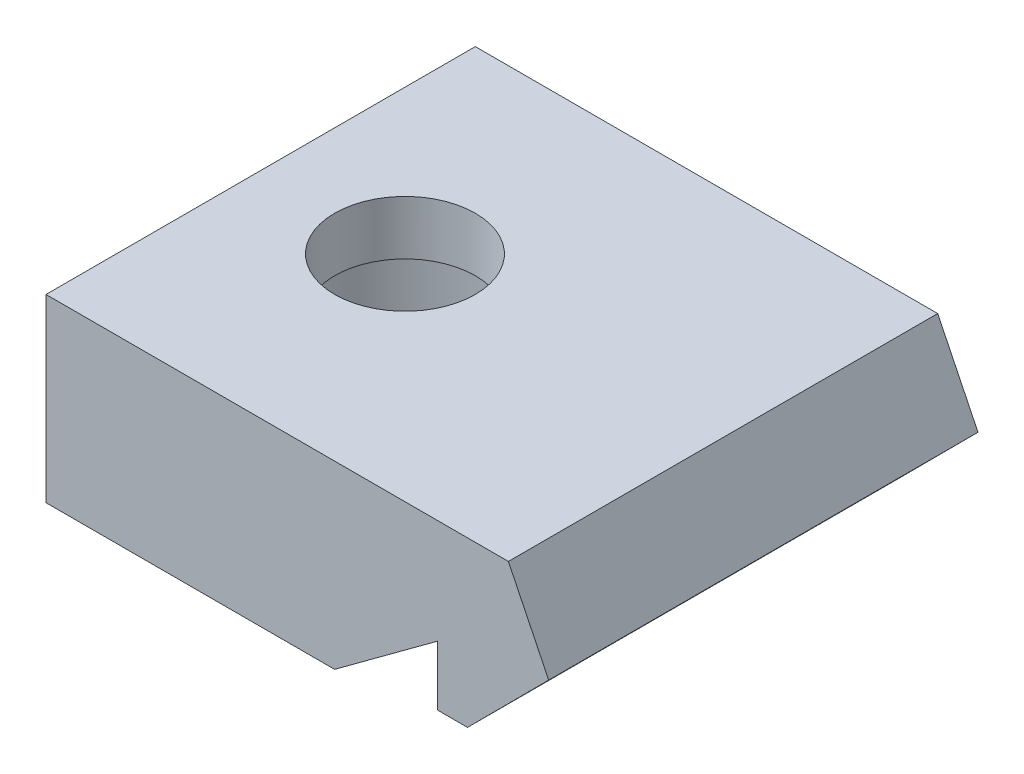
ISO-10303-21;
HEADER;
FILE_DESCRIPTION(('STEP AP214'),'2;1');
FILE_NAME('part.step','',(''),(''),'','','');
FILE_SCHEMA(('AUTOMOTIVE_DESIGN { 1 0 10303 214 1 1 1 1 }'));
ENDSEC;
DATA;
#1=APPLICATION_CONTEXT('core data for automotive mechanical design processes');
#2=APPLICATION_PROTOCOL_DEFINITION('international standard','automotive_design',2000,#1);
#3=PRODUCT_CONTEXT('',#1,'mechanical');
#4=PRODUCT('Part','Part','',(#3));
#5=PRODUCT_RELATED_PRODUCT_CATEGORY('part','',(#4));
#6=PRODUCT_DEFINITION_FORMATION('','',#4);
#7=PRODUCT_DEFINITION_CONTEXT('part definition',#1,'design');
#8=PRODUCT_DEFINITION('design','',#6,#7);
#9=PRODUCT_DEFINITION_SHAPE('','',#8);
#10=(LENGTH_UNIT() NAMED_UNIT(*) SI_UNIT(.MILLI.,.METRE.));
#11=(NAMED_UNIT(*) PLANE_ANGLE_UNIT() SI_UNIT($,.RADIAN.));
#12=(NAMED_UNIT(*) SI_UNIT($,.STERADIAN.) SOLID_ANGLE_UNIT());
#13=UNCERTAINTY_MEASURE_WITH_UNIT(LENGTH_MEASURE(1.E-05),#10,'distance_accuracy_value','');
#14=(GEOMETRIC_REPRESENTATION_CONTEXT(3) GLOBAL_UNCERTAINTY_ASSIGNED_CONTEXT((#13)) GLOBAL_UNIT_ASSIGNED_CONTEXT((#10,
#11,#12)) REPRESENTATION_CONTEXT('',''));
#15=CARTESIAN_POINT('',(0.,0.,0.));
#16=DIRECTION('',(0.,0.,1.));
#17=DIRECTION('',(1.,0.,0.));
#18=AXIS2_PLACEMENT_3D('',#15,#16,#17);
#19=CARTESIAN_POINT('',(4.,0.00100000000000013,0.));
#20=DIRECTION('',(0.,-1.,0.));
#21=DIRECTION('',(0.,0.,-1.));
#22=AXIS2_PLACEMENT_3D('',#19,#20,#21);
#23=CYLINDRICAL_SURFACE('',#22,1.95);
#24=CARTESIAN_POINT('',(4.,0.,0.));
#25=DIRECTION('',(0.,1.,0.));
#26=DIRECTION('',(0.,0.,1.));
#27=AXIS2_PLACEMENT_3D('',#24,#25,#26);
#28=CIRCLE('',#27,1.95);
#29=CARTESIAN_POINT('',(4.,0.,1.95));
#30=VERTEX_POINT('',#29);
#31=EDGE_CURVE('E136',#30,#30,#28,.F.);
#32=ORIENTED_EDGE('',*,*,#31,.F.);
#33=EDGE_LOOP('',(#32));
#34=FACE_BOUND('',#33,.T.);
#35=CARTESIAN_POINT('',(4.,-1.5,0.));
#36=DIRECTION('',(0.,-1.,0.));
#37=DIRECTION('',(0.,0.,-1.));
#38=AXIS2_PLACEMENT_3D('',#35,#36,#37);
#39=CIRCLE('',#38,1.95);
#40=CARTESIAN_POINT('',(4.,-1.5,-1.95));
#41=VERTEX_POINT('',#40);
#42=EDGE_CURVE('E39',#41,#41,#39,.F.);
#43=ORIENTED_EDGE('',*,*,#42,.F.);
#44=EDGE_LOOP('',(#43));
#45=FACE_BOUND('',#44,.T.);
#46=ADVANCED_FACE('F35',(#34,#45),#23,.F.);
#47=CARTESIAN_POINT('',(0.,-5.,5.95));
#48=DIRECTION('',(0.,1.,0.));
#49=DIRECTION('',(0.,0.,1.));
#50=AXIS2_PLACEMENT_3D('',#47,#48,#49);
#51=PLANE('',#50);
#52=CARTESIAN_POINT('',(4.,-5.,0.));
#53=DIRECTION('',(0.,-1.,0.));
#54=DIRECTION('',(0.,0.,-1.));
#55=AXIS2_PLACEMENT_3D('',#52,#53,#54);
#56=CIRCLE('',#55,3.5);
#57=CARTESIAN_POINT('',(4.,-5.,-3.5));
#58=VERTEX_POINT('',#57);
#59=EDGE_CURVE('E184',#58,#58,#56,.T.);
#60=ORIENTED_EDGE('',*,*,#59,.F.);
#61=EDGE_LOOP('',(#60));
#62=FACE_BOUND('',#61,.T.);
#63=DIRECTION('',(1.,0.,0.));
#64=VECTOR('',#63,1.);
#65=CARTESIAN_POINT('',(0.,-5.,-5.95));
#66=LINE('',#65,#64);
#67=CARTESIAN_POINT('',(0.,-5.,-5.95));
#68=VERTEX_POINT('',#67);
#69=CARTESIAN_POINT('',(8.,-5.,-5.95));
#70=VERTEX_POINT('',#69);
#71=EDGE_CURVE('E132',#68,#70,#66,.T.);
#72=ORIENTED_EDGE('',*,*,#71,.T.);
#73=DIRECTION('',(0.,0.,-1.));
#74=VECTOR('',#73,1.);
#75=CARTESIAN_POINT('',(8.,-5.,5.95));
#76=LINE('',#75,#74);
#77=CARTESIAN_POINT('',(8.,-5.,5.95));
#78=VERTEX_POINT('',#77);
#79=EDGE_CURVE('E11',#78,#70,#76,.T.);
#80=ORIENTED_EDGE('',*,*,#79,.F.);
#81=DIRECTION('',(1.,0.,0.));
#82=VECTOR('',#81,1.);
#83=CARTESIAN_POINT('',(0.,-5.,5.95));
#84=LINE('',#83,#82);
#85=CARTESIAN_POINT('',(0.,-5.,5.95));
#86=VERTEX_POINT('',#85);
#87=EDGE_CURVE('E148',#86,#78,#84,.T.);
#88=ORIENTED_EDGE('',*,*,#87,.F.);
#89=DIRECTION('',(0.,0.,-1.));
#90=VECTOR('',#89,1.);
#91=CARTESIAN_POINT('',(0.,-5.,5.95));
#92=LINE('',#91,#90);
#93=EDGE_CURVE('E128',#86,#68,#92,.T.);
#94=ORIENTED_EDGE('',*,*,#93,.T.);
#95=EDGE_LOOP('',(#72,#80,#88,#94));
#96=FACE_BOUND('',#95,.T.);
#97=ADVANCED_FACE('F37',(#62,#96),#51,.F.);
#98=CARTESIAN_POINT('',(5.2059710551942,-7.060223000472,5.95));
#99=DIRECTION('',(-0.593472483948854,0.804854279230457,0.));
#100=DIRECTION('',(-0.804854279230457,-0.593472483948854,0.));
#101=AXIS2_PLACEMENT_3D('',#98,#99,#100);
#102=PLANE('',#101);
#103=DIRECTION('',(0.804854279230457,0.593472483948854,0.));
#104=VECTOR('',#103,1.);
#105=CARTESIAN_POINT('',(5.2059710551942,-7.060223000472,-5.95));
#106=LINE('',#105,#104);
#107=CARTESIAN_POINT('',(10.8492750138885,-2.89904040572093,-5.95));
#108=VERTEX_POINT('',#107);
#109=EDGE_CURVE('E135',#70,#108,#106,.T.);
#110=ORIENTED_EDGE('',*,*,#109,.T.);
#111=DIRECTION('',(0.,0.,-1.));
#112=VECTOR('',#111,1.);
#113=CARTESIAN_POINT('',(10.8492750138885,-2.89904040572093,5.95));
#114=LINE('',#113,#112);
#115=CARTESIAN_POINT('',(10.8492750138885,-2.89904040572093,5.95));
#116=VERTEX_POINT('',#115);
#117=EDGE_CURVE('E45',#116,#108,#114,.T.);
#118=ORIENTED_EDGE('',*,*,#117,.F.);
#119=DIRECTION('',(0.804854279230457,0.593472483948854,0.));
#120=VECTOR('',#119,1.);
#121=CARTESIAN_POINT('',(5.2059710551942,-7.060223000472,5.95));
#122=LINE('',#121,#120);
#123=EDGE_CURVE('E92',#78,#116,#122,.T.);
#124=ORIENTED_EDGE('',*,*,#123,.F.);
#125=ORIENTED_EDGE('',*,*,#79,.T.);
#126=EDGE_LOOP('',(#110,#118,#124,#125));
#127=FACE_BOUND('',#126,.T.);
#128=ADVANCED_FACE('F202',(#127),#102,.F.);
#129=CARTESIAN_POINT('',(10.8492750138885,0.,5.95));
#130=DIRECTION('',(1.,0.,0.));
#131=DIRECTION('',(0.,0.,-1.));
#132=AXIS2_PLACEMENT_3D('',#129,#130,#131);
#133=PLANE('',#132);
#134=DIRECTION('',(0.,-1.,0.));
#135=VECTOR('',#134,1.);
#136=CARTESIAN_POINT('',(10.8492750138885,0.,-5.95));
#137=LINE('',#136,#135);
#138=CARTESIAN_POINT('',(10.8492750138885,-4.55119956607395,-5.95));
#139=VERTEX_POINT('',#138);
#140=EDGE_CURVE('E138',#108,#139,#137,.T.);
#141=ORIENTED_EDGE('',*,*,#140,.T.);
#142=DIRECTION('',(0.,0.,-1.));
#143=VECTOR('',#142,1.);
#144=CARTESIAN_POINT('',(10.8492750138885,-4.55119956607395,5.95));
#145=LINE('',#144,#143);
#146=CARTESIAN_POINT('',(10.8492750138885,-4.55119956607395,5.95));
#147=VERTEX_POINT('',#146);
#148=EDGE_CURVE('E155',#147,#139,#145,.T.);
#149=ORIENTED_EDGE('',*,*,#148,.F.);
#150=DIRECTION('',(0.,-1.,0.));
#151=VECTOR('',#150,1.);
#152=CARTESIAN_POINT('',(10.8492750138885,0.,5.95));
#153=LINE('',#152,#151);
#154=EDGE_CURVE('E164',#116,#147,#153,.T.);
#155=ORIENTED_EDGE('',*,*,#154,.F.);
#156=ORIENTED_EDGE('',*,*,#117,.T.);
#157=EDGE_LOOP('',(#141,#149,#155,#156));
#158=FACE_BOUND('',#157,.T.);
#159=ADVANCED_FACE('F162',(#158),#133,.F.);
#160=CARTESIAN_POINT('',(0.,-4.55119956607395,5.95));
#161=DIRECTION('',(0.,1.,0.));
#162=DIRECTION('',(0.,0.,1.));
#163=AXIS2_PLACEMENT_3D('',#160,#161,#162);
#164=PLANE('',#163);
#165=DIRECTION('',(1.,0.,0.));
#166=VECTOR('',#165,1.);
#167=CARTESIAN_POINT('',(0.,-4.55119956607395,-5.95));
#168=LINE('',#167,#166);
#169=CARTESIAN_POINT('',(11.6837002450459,-4.55119956607395,-5.95));
#170=VERTEX_POINT('',#169);
#171=EDGE_CURVE('E140',#139,#170,#168,.T.);
#172=ORIENTED_EDGE('',*,*,#171,.T.);
#173=DIRECTION('',(0.,0.,-1.));
#174=VECTOR('',#173,1.);
#175=CARTESIAN_POINT('',(11.6837002450459,-4.55119956607395,5.95));
#176=LINE('',#175,#174);
#177=CARTESIAN_POINT('',(11.6837002450459,-4.55119956607395,5.95));
#178=VERTEX_POINT('',#177);
#179=EDGE_CURVE('E152',#178,#170,#176,.T.);
#180=ORIENTED_EDGE('',*,*,#179,.F.);
#181=DIRECTION('',(1.,0.,0.));
#182=VECTOR('',#181,1.);
#183=CARTESIAN_POINT('',(0.,-4.55119956607395,5.95));
#184=LINE('',#183,#182);
#185=EDGE_CURVE('E176',#147,#178,#184,.T.);
#186=ORIENTED_EDGE('',*,*,#185,.F.);
#187=ORIENTED_EDGE('',*,*,#148,.T.);
#188=EDGE_LOOP('',(#172,#180,#186,#187));
#189=FACE_BOUND('',#188,.T.);
#190=ADVANCED_FACE('F172',(#189),#164,.F.);
#191=CARTESIAN_POINT('',(8.14380815321423,-8.10711386186035,5.95));
#192=DIRECTION('',(-0.708701609006506,0.70550834820829,0.));
#193=DIRECTION('',(-0.70550834820829,-0.708701609006506,0.));
#194=AXIS2_PLACEMENT_3D('',#191,#192,#193);
#195=PLANE('',#194);
#196=DIRECTION('',(0.70550834820829,0.708701609006506,0.));
#197=VECTOR('',#196,1.);
#198=CARTESIAN_POINT('',(8.14380815321423,-8.10711386186035,-5.95));
#199=LINE('',#198,#197);
#200=CARTESIAN_POINT('',(13.9337939797183,-2.2909214925011,-5.95));
#201=VERTEX_POINT('',#200);
#202=EDGE_CURVE('E142',#170,#201,#199,.T.);
#203=ORIENTED_EDGE('',*,*,#202,.T.);
#204=DIRECTION('',(0.,0.,-1.));
#205=VECTOR('',#204,1.);
#206=CARTESIAN_POINT('',(13.9337939797183,-2.2909214925011,5.95));
#207=LINE('',#206,#205);
#208=CARTESIAN_POINT('',(13.9337939797183,-2.2909214925011,5.95));
#209=VERTEX_POINT('',#208);
#210=EDGE_CURVE('E124',#209,#201,#207,.T.);
#211=ORIENTED_EDGE('',*,*,#210,.F.);
#212=DIRECTION('',(0.70550834820829,0.708701609006506,0.));
#213=VECTOR('',#212,1.);
#214=CARTESIAN_POINT('',(8.14380815321423,-8.10711386186035,5.95));
#215=LINE('',#214,#213);
#216=EDGE_CURVE('E111',#178,#209,#215,.T.);
#217=ORIENTED_EDGE('',*,*,#216,.F.);
#218=ORIENTED_EDGE('',*,*,#179,.T.);
#219=EDGE_LOOP('',(#203,#211,#217,#218));
#220=FACE_BOUND('',#219,.T.);
#221=ADVANCED_FACE('F175',(#220),#195,.F.);
#222=CARTESIAN_POINT('',(10.3549259412529,5.04897173889507,5.95));
#223=DIRECTION('',(-0.898844079831908,-0.438268547983004,0.));
#224=DIRECTION('',(0.438268547983004,-0.898844079831908,0.));
#225=AXIS2_PLACEMENT_3D('',#222,#223,#224);
#226=PLANE('',#225);
#227=DIRECTION('',(-0.438268547983004,0.898844079831908,0.));
#228=VECTOR('',#227,1.);
#229=CARTESIAN_POINT('',(10.3549259412529,5.04897173889507,-5.95));
#230=LINE('',#229,#228);
#231=CARTESIAN_POINT('',(12.8167606047538,0.,-5.95));
#232=VERTEX_POINT('',#231);
#233=EDGE_CURVE('E120',#201,#232,#230,.T.);
#234=ORIENTED_EDGE('',*,*,#233,.T.);
#235=DIRECTION('',(0.,0.,-1.));
#236=VECTOR('',#235,1.);
#237=CARTESIAN_POINT('',(12.8167606047538,0.,5.95));
#238=LINE('',#237,#236);
#239=CARTESIAN_POINT('',(12.8167606047538,0.,5.95));
#240=VERTEX_POINT('',#239);
#241=EDGE_CURVE('E117',#240,#232,#238,.T.);
#242=ORIENTED_EDGE('',*,*,#241,.F.);
#243=DIRECTION('',(-0.438268547983004,0.898844079831908,0.));
#244=VECTOR('',#243,1.);
#245=CARTESIAN_POINT('',(10.3549259412529,5.04897173889507,5.95));
#246=LINE('',#245,#244);
#247=EDGE_CURVE('E105',#209,#240,#246,.T.);
#248=ORIENTED_EDGE('',*,*,#247,.F.);
#249=ORIENTED_EDGE('',*,*,#210,.T.);
#250=EDGE_LOOP('',(#234,#242,#248,#249));
#251=FACE_BOUND('',#250,.T.);
#252=ADVANCED_FACE('F118',(#251),#226,.F.);
#253=CARTESIAN_POINT('',(0.,0.,5.95));
#254=DIRECTION('',(0.,1.,0.));
#255=DIRECTION('',(0.,0.,1.));
#256=AXIS2_PLACEMENT_3D('',#253,#254,#255);
#257=PLANE('',#256);
#258=ORIENTED_EDGE('',*,*,#31,.T.);
#259=EDGE_LOOP('',(#258));
#260=FACE_BOUND('',#259,.T.);
#261=DIRECTION('',(1.,0.,0.));
#262=VECTOR('',#261,1.);
#263=CARTESIAN_POINT('',(0.,0.,-5.95));
#264=LINE('',#263,#262);
#265=CARTESIAN_POINT('',(0.,0.,-5.95));
#266=VERTEX_POINT('',#265);
#267=EDGE_CURVE('E145',#266,#232,#264,.T.);
#268=ORIENTED_EDGE('',*,*,#267,.F.);
#269=DIRECTION('',(0.,0.,-1.));
#270=VECTOR('',#269,1.);
#271=CARTESIAN_POINT('',(0.,0.,5.95));
#272=LINE('',#271,#270);
#273=CARTESIAN_POINT('',(0.,0.,5.95));
#274=VERTEX_POINT('',#273);
#275=EDGE_CURVE('E81',#274,#266,#272,.T.);
#276=ORIENTED_EDGE('',*,*,#275,.F.);
#277=DIRECTION('',(1.,0.,0.));
#278=VECTOR('',#277,1.);
#279=CARTESIAN_POINT('',(0.,0.,5.95));
#280=LINE('',#279,#278);
#281=EDGE_CURVE('E109',#274,#240,#280,.T.);
#282=ORIENTED_EDGE('',*,*,#281,.T.);
#283=ORIENTED_EDGE('',*,*,#241,.T.);
#284=EDGE_LOOP('',(#268,#276,#282,#283));
#285=FACE_BOUND('',#284,.T.);
#286=ADVANCED_FACE('F126',(#260,#285),#257,.T.);
#287=CARTESIAN_POINT('',(0.,0.,5.95));
#288=DIRECTION('',(1.,0.,0.));
#289=DIRECTION('',(0.,1.,0.));
#290=AXIS2_PLACEMENT_3D('',#287,#288,#289);
#291=PLANE('',#290);
#292=DIRECTION('',(0.,-1.,0.));
#293=VECTOR('',#292,1.);
#294=CARTESIAN_POINT('',(0.,0.,-5.95));
#295=LINE('',#294,#293);
#296=EDGE_CURVE('E84',#266,#68,#295,.T.);
#297=ORIENTED_EDGE('',*,*,#296,.T.);
#298=ORIENTED_EDGE('',*,*,#93,.F.);
#299=DIRECTION('',(0.,-1.,0.));
#300=VECTOR('',#299,1.);
#301=CARTESIAN_POINT('',(0.,0.,5.95));
#302=LINE('',#301,#300);
#303=EDGE_CURVE('E53',#274,#86,#302,.T.);
#304=ORIENTED_EDGE('',*,*,#303,.F.);
#305=ORIENTED_EDGE('',*,*,#275,.T.);
#306=EDGE_LOOP('',(#297,#298,#304,#305));
#307=FACE_BOUND('',#306,.T.);
#308=ADVANCED_FACE('F211',(#307),#291,.F.);
#309=CARTESIAN_POINT('',(0.,0.,5.95));
#310=DIRECTION('',(0.,0.,1.));
#311=DIRECTION('',(1.,0.,0.));
#312=AXIS2_PLACEMENT_3D('',#309,#310,#311);
#313=PLANE('',#312);
#314=ORIENTED_EDGE('',*,*,#87,.T.);
#315=ORIENTED_EDGE('',*,*,#123,.T.);
#316=ORIENTED_EDGE('',*,*,#154,.T.);
#317=ORIENTED_EDGE('',*,*,#185,.T.);
#318=ORIENTED_EDGE('',*,*,#216,.T.);
#319=ORIENTED_EDGE('',*,*,#247,.T.);
#320=ORIENTED_EDGE('',*,*,#281,.F.);
#321=ORIENTED_EDGE('',*,*,#303,.T.);
#322=EDGE_LOOP('',(#314,#315,#316,#317,#318,#319,#320,#321));
#323=FACE_BOUND('',#322,.T.);
#324=ADVANCED_FACE('F107',(#323),#313,.T.);
#325=CARTESIAN_POINT('',(0.,0.,-5.95));
#326=DIRECTION('',(0.,0.,1.));
#327=DIRECTION('',(1.,0.,0.));
#328=AXIS2_PLACEMENT_3D('',#325,#326,#327);
#329=PLANE('',#328);
#330=ORIENTED_EDGE('',*,*,#71,.F.);
#331=ORIENTED_EDGE('',*,*,#296,.F.);
#332=ORIENTED_EDGE('',*,*,#267,.T.);
#333=ORIENTED_EDGE('',*,*,#233,.F.);
#334=ORIENTED_EDGE('',*,*,#202,.F.);
#335=ORIENTED_EDGE('',*,*,#171,.F.);
#336=ORIENTED_EDGE('',*,*,#140,.F.);
#337=ORIENTED_EDGE('',*,*,#109,.F.);
#338=EDGE_LOOP('',(#330,#331,#332,#333,#334,#335,#336,#337));
#339=FACE_BOUND('',#338,.T.);
#340=ADVANCED_FACE('F168',(#339),#329,.F.);
#341=CARTESIAN_POINT('',(4.,-1.5,0.));
#342=DIRECTION('',(0.,-1.,0.));
#343=DIRECTION('',(0.,0.,-1.));
#344=AXIS2_PLACEMENT_3D('',#341,#342,#343);
#345=PLANE('',#344);
#346=CARTESIAN_POINT('',(4.,-1.5,0.));
#347=DIRECTION('',(0.,-1.,0.));
#348=DIRECTION('',(0.,0.,-1.));
#349=AXIS2_PLACEMENT_3D('',#346,#347,#348);
#350=CIRCLE('',#349,3.5);
#351=CARTESIAN_POINT('',(4.,-1.5,-3.5));
#352=VERTEX_POINT('',#351);
#353=EDGE_CURVE('E187',#352,#352,#350,.T.);
#354=ORIENTED_EDGE('',*,*,#353,.T.);
#355=EDGE_LOOP('',(#354));
#356=FACE_BOUND('',#355,.T.);
#357=ORIENTED_EDGE('',*,*,#42,.T.);
#358=EDGE_LOOP('',(#357));
#359=FACE_BOUND('',#358,.T.);
#360=ADVANCED_FACE('F194',(#356,#359),#345,.T.);
#361=CARTESIAN_POINT('',(4.,-1.5,0.));
#362=DIRECTION('',(0.,-1.,0.));
#363=DIRECTION('',(0.,0.,-1.));
#364=AXIS2_PLACEMENT_3D('',#361,#362,#363);
#365=CYLINDRICAL_SURFACE('',#364,3.5);
#366=ORIENTED_EDGE('',*,*,#353,.F.);
#367=EDGE_LOOP('',(#366));
#368=FACE_BOUND('',#367,.T.);
#369=ORIENTED_EDGE('',*,*,#59,.T.);
#370=EDGE_LOOP('',(#369));
#371=FACE_BOUND('',#370,.T.);
#372=ADVANCED_FACE('F207',(#368,#371),#365,.F.);
#373=CLOSED_SHELL('',(#46,#97,#128,#159,#190,#221,#252,#286,#308,#324,#340,#360,#372));
#374=MANIFOLD_SOLID_BREP('B2',#373);
#375=ADVANCED_BREP_SHAPE_REPRESENTATION('',(#18,#374),#14);
#376=SHAPE_DEFINITION_REPRESENTATION(#9,#375);
ENDSEC;
END-ISO-10303-21;
